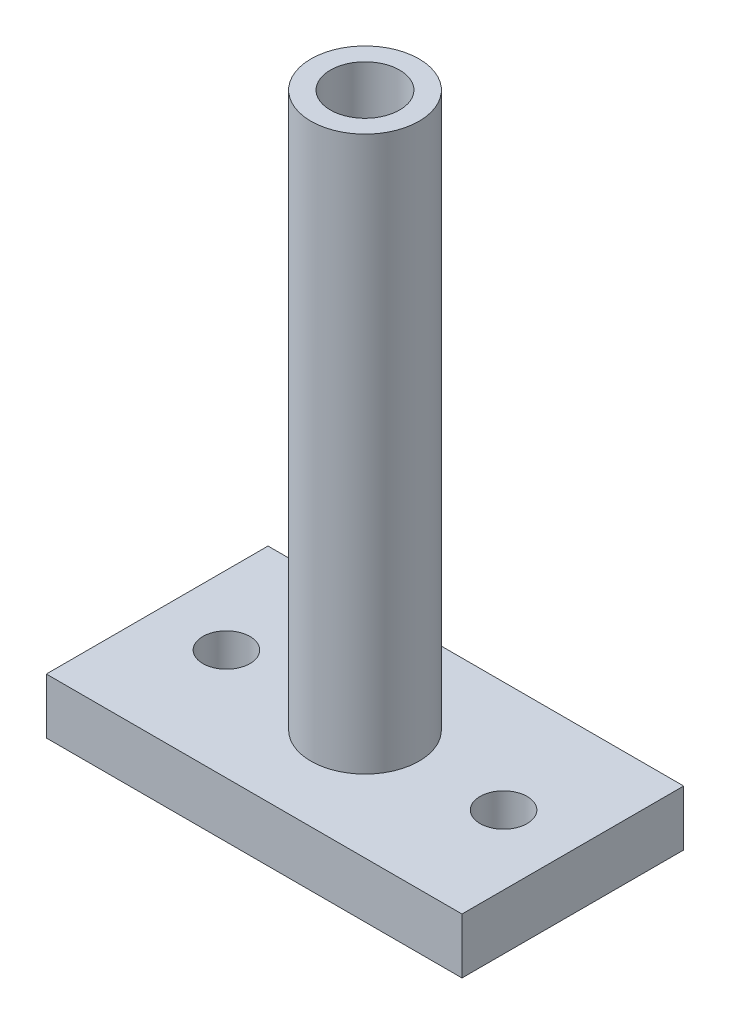
ISO-10303-21;
HEADER;
FILE_DESCRIPTION(('STEP AP214'),'2;1');
FILE_NAME('part.step','',(''),(''),'','','');
FILE_SCHEMA(('AUTOMOTIVE_DESIGN { 1 0 10303 214 1 1 1 1 }'));
ENDSEC;
DATA;
#1=APPLICATION_CONTEXT('core data for automotive mechanical design processes');
#2=APPLICATION_PROTOCOL_DEFINITION('international standard','automotive_design',2000,#1);
#3=PRODUCT_CONTEXT('',#1,'mechanical');
#4=PRODUCT('Part','Part','',(#3));
#5=PRODUCT_RELATED_PRODUCT_CATEGORY('part','',(#4));
#6=PRODUCT_DEFINITION_FORMATION('','',#4);
#7=PRODUCT_DEFINITION_CONTEXT('part definition',#1,'design');
#8=PRODUCT_DEFINITION('design','',#6,#7);
#9=PRODUCT_DEFINITION_SHAPE('','',#8);
#10=(LENGTH_UNIT() NAMED_UNIT(*) SI_UNIT(.MILLI.,.METRE.));
#11=(NAMED_UNIT(*) PLANE_ANGLE_UNIT() SI_UNIT($,.RADIAN.));
#12=(NAMED_UNIT(*) SI_UNIT($,.STERADIAN.) SOLID_ANGLE_UNIT());
#13=UNCERTAINTY_MEASURE_WITH_UNIT(LENGTH_MEASURE(1.E-05),#10,'distance_accuracy_value','');
#14=(GEOMETRIC_REPRESENTATION_CONTEXT(3) GLOBAL_UNCERTAINTY_ASSIGNED_CONTEXT((#13)) GLOBAL_UNIT_ASSIGNED_CONTEXT((#10,
#11,#12)) REPRESENTATION_CONTEXT('',''));
#15=CARTESIAN_POINT('',(0.,0.,0.));
#16=DIRECTION('',(0.,0.,1.));
#17=DIRECTION('',(1.,0.,0.));
#18=AXIS2_PLACEMENT_3D('',#15,#16,#17);
#19=CARTESIAN_POINT('',(0.,2.,0.));
#20=DIRECTION('',(0.,-1.,0.));
#21=DIRECTION('',(0.,0.,-1.));
#22=AXIS2_PLACEMENT_3D('',#19,#20,#21);
#23=PLANE('',#22);
#24=CARTESIAN_POINT('',(7.5,2.,-4.));
#25=DIRECTION('',(0.,-1.,0.));
#26=DIRECTION('',(0.,0.,-1.));
#27=AXIS2_PLACEMENT_3D('',#24,#25,#26);
#28=CIRCLE('',#27,1.95);
#29=CARTESIAN_POINT('',(7.5,2.,-5.95));
#30=VERTEX_POINT('',#29);
#31=EDGE_CURVE('E11',#30,#30,#28,.F.);
#32=ORIENTED_EDGE('',*,*,#31,.F.);
#33=EDGE_LOOP('',(#32));
#34=FACE_BOUND('',#33,.T.);
#35=DIRECTION('',(0.,0.,1.));
#36=VECTOR('',#35,1.);
#37=CARTESIAN_POINT('',(0.,2.,0.));
#38=LINE('',#37,#36);
#39=CARTESIAN_POINT('',(0.,2.,-8.));
#40=VERTEX_POINT('',#39);
#41=CARTESIAN_POINT('',(0.,2.,0.));
#42=VERTEX_POINT('',#41);
#43=EDGE_CURVE('E96',#40,#42,#38,.T.);
#44=ORIENTED_EDGE('',*,*,#43,.T.);
#45=DIRECTION('',(1.,0.,0.));
#46=VECTOR('',#45,1.);
#47=CARTESIAN_POINT('',(0.,2.,0.));
#48=LINE('',#47,#46);
#49=CARTESIAN_POINT('',(15.,2.,0.));
#50=VERTEX_POINT('',#49);
#51=EDGE_CURVE('E91',#42,#50,#48,.T.);
#52=ORIENTED_EDGE('',*,*,#51,.T.);
#53=DIRECTION('',(0.,0.,-1.));
#54=VECTOR('',#53,1.);
#55=CARTESIAN_POINT('',(15.,2.,0.));
#56=LINE('',#55,#54);
#57=CARTESIAN_POINT('',(15.,2.,-8.));
#58=VERTEX_POINT('',#57);
#59=EDGE_CURVE('E94',#50,#58,#56,.T.);
#60=ORIENTED_EDGE('',*,*,#59,.T.);
#61=DIRECTION('',(-1.,0.,0.));
#62=VECTOR('',#61,1.);
#63=CARTESIAN_POINT('',(0.,2.,-8.));
#64=LINE('',#63,#62);
#65=EDGE_CURVE('E60',#58,#40,#64,.T.);
#66=ORIENTED_EDGE('',*,*,#65,.T.);
#67=EDGE_LOOP('',(#44,#52,#60,#66));
#68=FACE_BOUND('',#67,.T.);
#69=CARTESIAN_POINT('',(2.5,2.,-4.));
#70=DIRECTION('',(0.,1.,0.));
#71=DIRECTION('',(0.,0.,1.));
#72=AXIS2_PLACEMENT_3D('',#69,#70,#71);
#73=CIRCLE('',#72,0.85);
#74=CARTESIAN_POINT('',(2.5,2.,-3.15));
#75=VERTEX_POINT('',#74);
#76=EDGE_CURVE('E113',#75,#75,#73,.T.);
#77=ORIENTED_EDGE('',*,*,#76,.F.);
#78=EDGE_LOOP('',(#77));
#79=FACE_BOUND('',#78,.T.);
#80=CARTESIAN_POINT('',(12.5,2.,-4.));
#81=DIRECTION('',(0.,1.,0.));
#82=DIRECTION('',(0.,0.,-1.));
#83=AXIS2_PLACEMENT_3D('',#80,#81,#82);
#84=CIRCLE('',#83,0.85);
#85=CARTESIAN_POINT('',(12.5,2.,-4.85));
#86=VERTEX_POINT('',#85);
#87=EDGE_CURVE('E130',#86,#86,#84,.T.);
#88=ORIENTED_EDGE('',*,*,#87,.F.);
#89=EDGE_LOOP('',(#88));
#90=FACE_BOUND('',#89,.T.);
#91=ADVANCED_FACE('F43',(#34,#68,#79,#90),#23,.F.);
#92=CARTESIAN_POINT('',(0.,0.,0.));
#93=DIRECTION('',(0.,-1.,0.));
#94=DIRECTION('',(0.,0.,-1.));
#95=AXIS2_PLACEMENT_3D('',#92,#93,#94);
#96=PLANE('',#95);
#97=CARTESIAN_POINT('',(2.5,0.,-4.));
#98=DIRECTION('',(0.,1.,0.));
#99=DIRECTION('',(0.,0.,1.));
#100=AXIS2_PLACEMENT_3D('',#97,#98,#99);
#101=CIRCLE('',#100,0.85);
#102=CARTESIAN_POINT('',(2.5,0.,-3.15));
#103=VERTEX_POINT('',#102);
#104=EDGE_CURVE('E134',#103,#103,#101,.T.);
#105=ORIENTED_EDGE('',*,*,#104,.T.);
#106=EDGE_LOOP('',(#105));
#107=FACE_BOUND('',#106,.T.);
#108=DIRECTION('',(0.,0.,1.));
#109=VECTOR('',#108,1.);
#110=CARTESIAN_POINT('',(0.,0.,0.));
#111=LINE('',#110,#109);
#112=CARTESIAN_POINT('',(0.,0.,-8.));
#113=VERTEX_POINT('',#112);
#114=CARTESIAN_POINT('',(0.,0.,0.));
#115=VERTEX_POINT('',#114);
#116=EDGE_CURVE('E110',#113,#115,#111,.T.);
#117=ORIENTED_EDGE('',*,*,#116,.F.);
#118=DIRECTION('',(-1.,0.,0.));
#119=VECTOR('',#118,1.);
#120=CARTESIAN_POINT('',(0.,0.,-8.));
#121=LINE('',#120,#119);
#122=CARTESIAN_POINT('',(15.,0.,-8.));
#123=VERTEX_POINT('',#122);
#124=EDGE_CURVE('E83',#123,#113,#121,.T.);
#125=ORIENTED_EDGE('',*,*,#124,.F.);
#126=DIRECTION('',(0.,0.,-1.));
#127=VECTOR('',#126,1.);
#128=CARTESIAN_POINT('',(15.,0.,0.));
#129=LINE('',#128,#127);
#130=CARTESIAN_POINT('',(15.,0.,0.));
#131=VERTEX_POINT('',#130);
#132=EDGE_CURVE('E77',#131,#123,#129,.T.);
#133=ORIENTED_EDGE('',*,*,#132,.F.);
#134=DIRECTION('',(1.,0.,0.));
#135=VECTOR('',#134,1.);
#136=CARTESIAN_POINT('',(0.,0.,0.));
#137=LINE('',#136,#135);
#138=EDGE_CURVE('E101',#115,#131,#137,.T.);
#139=ORIENTED_EDGE('',*,*,#138,.F.);
#140=EDGE_LOOP('',(#117,#125,#133,#139));
#141=FACE_BOUND('',#140,.T.);
#142=CARTESIAN_POINT('',(12.5,0.,-4.));
#143=DIRECTION('',(0.,1.,0.));
#144=DIRECTION('',(0.,0.,-1.));
#145=AXIS2_PLACEMENT_3D('',#142,#143,#144);
#146=CIRCLE('',#145,0.85);
#147=CARTESIAN_POINT('',(12.5,0.,-4.85));
#148=VERTEX_POINT('',#147);
#149=EDGE_CURVE('E128',#148,#148,#146,.T.);
#150=ORIENTED_EDGE('',*,*,#149,.T.);
#151=EDGE_LOOP('',(#150));
#152=FACE_BOUND('',#151,.T.);
#153=ADVANCED_FACE('F121',(#107,#141,#152),#96,.T.);
#154=CARTESIAN_POINT('',(0.,2.,0.));
#155=DIRECTION('',(1.,0.,0.));
#156=DIRECTION('',(0.,0.,-1.));
#157=AXIS2_PLACEMENT_3D('',#154,#155,#156);
#158=PLANE('',#157);
#159=ORIENTED_EDGE('',*,*,#116,.T.);
#160=DIRECTION('',(0.,-1.,0.));
#161=VECTOR('',#160,1.);
#162=CARTESIAN_POINT('',(0.,2.,0.));
#163=LINE('',#162,#161);
#164=EDGE_CURVE('E52',#42,#115,#163,.T.);
#165=ORIENTED_EDGE('',*,*,#164,.F.);
#166=ORIENTED_EDGE('',*,*,#43,.F.);
#167=DIRECTION('',(0.,-1.,0.));
#168=VECTOR('',#167,1.);
#169=CARTESIAN_POINT('',(0.,2.,-8.));
#170=LINE('',#169,#168);
#171=EDGE_CURVE('E106',#40,#113,#170,.T.);
#172=ORIENTED_EDGE('',*,*,#171,.T.);
#173=EDGE_LOOP('',(#159,#165,#166,#172));
#174=FACE_BOUND('',#173,.T.);
#175=ADVANCED_FACE('F45',(#174),#158,.F.);
#176=CARTESIAN_POINT('',(0.,2.,0.));
#177=DIRECTION('',(0.,0.,-1.));
#178=DIRECTION('',(-1.,0.,0.));
#179=AXIS2_PLACEMENT_3D('',#176,#177,#178);
#180=PLANE('',#179);
#181=ORIENTED_EDGE('',*,*,#138,.T.);
#182=DIRECTION('',(0.,-1.,0.));
#183=VECTOR('',#182,1.);
#184=CARTESIAN_POINT('',(15.,2.,0.));
#185=LINE('',#184,#183);
#186=EDGE_CURVE('E99',#50,#131,#185,.T.);
#187=ORIENTED_EDGE('',*,*,#186,.F.);
#188=ORIENTED_EDGE('',*,*,#51,.F.);
#189=ORIENTED_EDGE('',*,*,#164,.T.);
#190=EDGE_LOOP('',(#181,#187,#188,#189));
#191=FACE_BOUND('',#190,.T.);
#192=ADVANCED_FACE('F100',(#191),#180,.F.);
#193=CARTESIAN_POINT('',(15.,2.,0.));
#194=DIRECTION('',(-1.,0.,0.));
#195=DIRECTION('',(0.,0.,1.));
#196=AXIS2_PLACEMENT_3D('',#193,#194,#195);
#197=PLANE('',#196);
#198=ORIENTED_EDGE('',*,*,#132,.T.);
#199=DIRECTION('',(0.,-1.,0.));
#200=VECTOR('',#199,1.);
#201=CARTESIAN_POINT('',(15.,2.,-8.));
#202=LINE('',#201,#200);
#203=EDGE_CURVE('E102',#58,#123,#202,.T.);
#204=ORIENTED_EDGE('',*,*,#203,.F.);
#205=ORIENTED_EDGE('',*,*,#59,.F.);
#206=ORIENTED_EDGE('',*,*,#186,.T.);
#207=EDGE_LOOP('',(#198,#204,#205,#206));
#208=FACE_BOUND('',#207,.T.);
#209=ADVANCED_FACE('F104',(#208),#197,.F.);
#210=CARTESIAN_POINT('',(0.,2.,-8.));
#211=DIRECTION('',(0.,0.,1.));
#212=DIRECTION('',(1.,0.,0.));
#213=AXIS2_PLACEMENT_3D('',#210,#211,#212);
#214=PLANE('',#213);
#215=ORIENTED_EDGE('',*,*,#124,.T.);
#216=ORIENTED_EDGE('',*,*,#171,.F.);
#217=ORIENTED_EDGE('',*,*,#65,.F.);
#218=ORIENTED_EDGE('',*,*,#203,.T.);
#219=EDGE_LOOP('',(#215,#216,#217,#218));
#220=FACE_BOUND('',#219,.T.);
#221=ADVANCED_FACE('F148',(#220),#214,.F.);
#222=CARTESIAN_POINT('',(2.5,2.,-4.));
#223=DIRECTION('',(0.,-1.,0.));
#224=DIRECTION('',(0.,0.,-1.));
#225=AXIS2_PLACEMENT_3D('',#222,#223,#224);
#226=CYLINDRICAL_SURFACE('',#225,0.85);
#227=ORIENTED_EDGE('',*,*,#76,.T.);
#228=EDGE_LOOP('',(#227));
#229=FACE_BOUND('',#228,.T.);
#230=ORIENTED_EDGE('',*,*,#104,.F.);
#231=EDGE_LOOP('',(#230));
#232=FACE_BOUND('',#231,.T.);
#233=ADVANCED_FACE('F145',(#229,#232),#226,.F.);
#234=CARTESIAN_POINT('',(12.5,2.,-4.));
#235=DIRECTION('',(0.,-1.,0.));
#236=DIRECTION('',(0.,0.,-1.));
#237=AXIS2_PLACEMENT_3D('',#234,#235,#236);
#238=CYLINDRICAL_SURFACE('',#237,0.85);
#239=ORIENTED_EDGE('',*,*,#87,.T.);
#240=EDGE_LOOP('',(#239));
#241=FACE_BOUND('',#240,.T.);
#242=ORIENTED_EDGE('',*,*,#149,.F.);
#243=EDGE_LOOP('',(#242));
#244=FACE_BOUND('',#243,.T.);
#245=ADVANCED_FACE('F147',(#241,#244),#238,.F.);
#246=CARTESIAN_POINT('',(7.5,22.,-4.));
#247=DIRECTION('',(0.,-1.,0.));
#248=DIRECTION('',(0.,0.,-1.));
#249=AXIS2_PLACEMENT_3D('',#246,#247,#248);
#250=CYLINDRICAL_SURFACE('',#249,1.95);
#251=CARTESIAN_POINT('',(7.5,22.,-4.));
#252=DIRECTION('',(0.,1.,0.));
#253=DIRECTION('',(0.,0.,1.));
#254=AXIS2_PLACEMENT_3D('',#251,#252,#253);
#255=CIRCLE('',#254,1.95);
#256=CARTESIAN_POINT('',(7.5,22.,-2.05));
#257=VERTEX_POINT('',#256);
#258=EDGE_CURVE('E131',#257,#257,#255,.T.);
#259=ORIENTED_EDGE('',*,*,#258,.F.);
#260=EDGE_LOOP('',(#259));
#261=FACE_BOUND('',#260,.T.);
#262=ORIENTED_EDGE('',*,*,#31,.T.);
#263=EDGE_LOOP('',(#262));
#264=FACE_BOUND('',#263,.T.);
#265=ADVANCED_FACE('F155',(#261,#264),#250,.T.);
#266=CARTESIAN_POINT('',(7.5,22.,-4.));
#267=DIRECTION('',(0.,1.,0.));
#268=DIRECTION('',(0.,0.,1.));
#269=AXIS2_PLACEMENT_3D('',#266,#267,#268);
#270=PLANE('',#269);
#271=CARTESIAN_POINT('',(7.5,22.,-4.));
#272=DIRECTION('',(0.,1.,0.));
#273=DIRECTION('',(0.,0.,1.));
#274=AXIS2_PLACEMENT_3D('',#271,#272,#273);
#275=CIRCLE('',#274,1.25);
#276=CARTESIAN_POINT('',(7.5,22.,-2.75));
#277=VERTEX_POINT('',#276);
#278=EDGE_CURVE('E251',#277,#277,#275,.T.);
#279=ORIENTED_EDGE('',*,*,#278,.F.);
#280=EDGE_LOOP('',(#279));
#281=FACE_BOUND('',#280,.T.);
#282=ORIENTED_EDGE('',*,*,#258,.T.);
#283=EDGE_LOOP('',(#282));
#284=FACE_BOUND('',#283,.T.);
#285=ADVANCED_FACE('F215',(#281,#284),#270,.T.);
#286=CARTESIAN_POINT('',(7.5,17.,-4.));
#287=DIRECTION('',(0.,1.,0.));
#288=DIRECTION('',(0.,0.,1.));
#289=AXIS2_PLACEMENT_3D('',#286,#287,#288);
#290=CYLINDRICAL_SURFACE('',#289,1.25);
#291=CARTESIAN_POINT('',(7.5,17.,-4.));
#292=DIRECTION('',(0.,1.,0.));
#293=DIRECTION('',(0.,0.,1.));
#294=AXIS2_PLACEMENT_3D('',#291,#292,#293);
#295=CIRCLE('',#294,1.25);
#296=CARTESIAN_POINT('',(7.5,17.,-2.75));
#297=VERTEX_POINT('',#296);
#298=EDGE_CURVE('E137',#297,#297,#295,.T.);
#299=ORIENTED_EDGE('',*,*,#298,.F.);
#300=EDGE_LOOP('',(#299));
#301=FACE_BOUND('',#300,.T.);
#302=ORIENTED_EDGE('',*,*,#278,.T.);
#303=EDGE_LOOP('',(#302));
#304=FACE_BOUND('',#303,.T.);
#305=ADVANCED_FACE('F224',(#301,#304),#290,.F.);
#306=CARTESIAN_POINT('',(7.5,17.,-4.));
#307=DIRECTION('',(0.,1.,0.));
#308=DIRECTION('',(0.,0.,1.));
#309=AXIS2_PLACEMENT_3D('',#306,#307,#308);
#310=PLANE('',#309);
#311=ORIENTED_EDGE('',*,*,#298,.T.);
#312=EDGE_LOOP('',(#311));
#313=FACE_BOUND('',#312,.T.);
#314=ADVANCED_FACE('F233',(#313),#310,.T.);
#315=CLOSED_SHELL('',(#91,#153,#175,#192,#209,#221,#233,#245,#265,#285,#305,#314));
#316=MANIFOLD_SOLID_BREP('B2',#315);
#317=ADVANCED_BREP_SHAPE_REPRESENTATION('',(#18,#316),#14);
#318=SHAPE_DEFINITION_REPRESENTATION(#9,#317);
ENDSEC;
END-ISO-10303-21;
